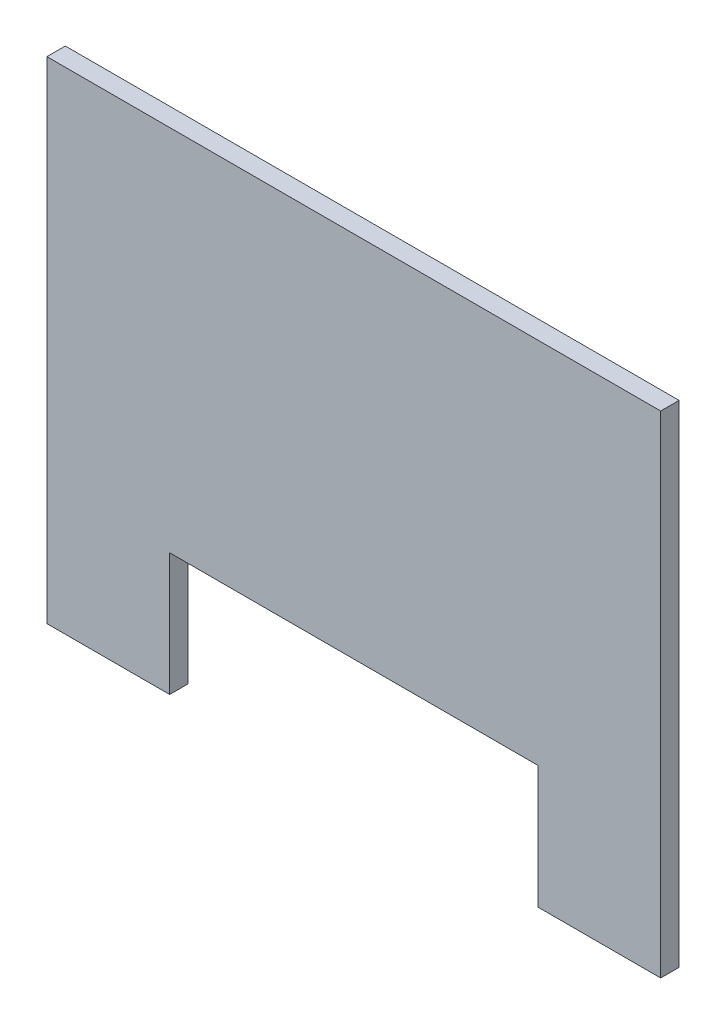
ISO-10303-21;
HEADER;
FILE_DESCRIPTION(('STEP AP214'),'2;1');
FILE_NAME('part.step','',(''),(''),'','','');
FILE_SCHEMA(('AUTOMOTIVE_DESIGN { 1 0 10303 214 1 1 1 1 }'));
ENDSEC;
DATA;
#1=APPLICATION_CONTEXT('core data for automotive mechanical design processes');
#2=APPLICATION_PROTOCOL_DEFINITION('international standard','automotive_design',2000,#1);
#3=PRODUCT_CONTEXT('',#1,'mechanical');
#4=PRODUCT('Part','Part','',(#3));
#5=PRODUCT_RELATED_PRODUCT_CATEGORY('part','',(#4));
#6=PRODUCT_DEFINITION_FORMATION('','',#4);
#7=PRODUCT_DEFINITION_CONTEXT('part definition',#1,'design');
#8=PRODUCT_DEFINITION('design','',#6,#7);
#9=PRODUCT_DEFINITION_SHAPE('','',#8);
#10=(LENGTH_UNIT() NAMED_UNIT(*) SI_UNIT(.MILLI.,.METRE.));
#11=(NAMED_UNIT(*) PLANE_ANGLE_UNIT() SI_UNIT($,.RADIAN.));
#12=(NAMED_UNIT(*) SI_UNIT($,.STERADIAN.) SOLID_ANGLE_UNIT());
#13=UNCERTAINTY_MEASURE_WITH_UNIT(LENGTH_MEASURE(1.E-05),#10,'distance_accuracy_value','');
#14=(GEOMETRIC_REPRESENTATION_CONTEXT(3) GLOBAL_UNCERTAINTY_ASSIGNED_CONTEXT((#13)) GLOBAL_UNIT_ASSIGNED_CONTEXT((#10,
#11,#12)) REPRESENTATION_CONTEXT('',''));
#15=CARTESIAN_POINT('',(0.,0.,0.));
#16=DIRECTION('',(0.,0.,1.));
#17=DIRECTION('',(1.,0.,0.));
#18=AXIS2_PLACEMENT_3D('',#15,#16,#17);
#19=CARTESIAN_POINT('',(-36.6014890834855,-21.0017574692443,3.));
#20=DIRECTION('',(1.,0.,0.));
#21=DIRECTION('',(0.,0.,-1.));
#22=AXIS2_PLACEMENT_3D('',#19,#20,#21);
#23=PLANE('',#22);
#24=DIRECTION('',(0.,-1.,0.));
#25=VECTOR('',#24,1.);
#26=CARTESIAN_POINT('',(-36.6014890834855,-21.0017574692443,0.));
#27=LINE('',#26,#25);
#28=CARTESIAN_POINT('',(-36.6014890834855,18.9279437609842,0.));
#29=VERTEX_POINT('',#28);
#30=CARTESIAN_POINT('',(-36.6014890834855,-61.0720562390158,0.));
#31=VERTEX_POINT('',#30);
#32=EDGE_CURVE('E90',#29,#31,#27,.T.);
#33=ORIENTED_EDGE('',*,*,#32,.T.);
#34=DIRECTION('',(0.,0.,-1.));
#35=VECTOR('',#34,1.);
#36=CARTESIAN_POINT('',(-36.6014890834855,-61.0720562390158,3.));
#37=LINE('',#36,#35);
#38=CARTESIAN_POINT('',(-36.6014890834855,-61.0720562390158,3.));
#39=VERTEX_POINT('',#38);
#40=EDGE_CURVE('E11',#39,#31,#37,.T.);
#41=ORIENTED_EDGE('',*,*,#40,.F.);
#42=DIRECTION('',(0.,-1.,0.));
#43=VECTOR('',#42,1.);
#44=CARTESIAN_POINT('',(-36.6014890834855,18.9279437609842,3.));
#45=LINE('',#44,#43);
#46=CARTESIAN_POINT('',(-36.6014890834855,18.9279437609842,3.));
#47=VERTEX_POINT('',#46);
#48=EDGE_CURVE('E96',#47,#39,#45,.T.);
#49=ORIENTED_EDGE('',*,*,#48,.F.);
#50=DIRECTION('',(0.,0.,-1.));
#51=VECTOR('',#50,1.);
#52=CARTESIAN_POINT('',(-36.6014890834855,18.9279437609842,3.));
#53=LINE('',#52,#51);
#54=EDGE_CURVE('E131',#47,#29,#53,.T.);
#55=ORIENTED_EDGE('',*,*,#54,.T.);
#56=EDGE_LOOP('',(#33,#41,#49,#55));
#57=FACE_BOUND('',#56,.T.);
#58=ADVANCED_FACE('F39',(#57),#23,.F.);
#59=CARTESIAN_POINT('',(-36.6014890834855,-61.0720562390158,3.));
#60=DIRECTION('',(0.,1.,0.));
#61=DIRECTION('',(0.,0.,1.));
#62=AXIS2_PLACEMENT_3D('',#59,#60,#61);
#63=PLANE('',#62);
#64=DIRECTION('',(1.,0.,0.));
#65=VECTOR('',#64,1.);
#66=CARTESIAN_POINT('',(-36.6014890834855,-61.0720562390158,0.));
#67=LINE('',#66,#65);
#68=CARTESIAN_POINT('',(-16.6014890834855,-61.0720562390158,0.));
#69=VERTEX_POINT('',#68);
#70=EDGE_CURVE('E136',#31,#69,#67,.T.);
#71=ORIENTED_EDGE('',*,*,#70,.T.);
#72=DIRECTION('',(0.,0.,-1.));
#73=VECTOR('',#72,1.);
#74=CARTESIAN_POINT('',(-16.6014890834855,-61.0720562390158,3.));
#75=LINE('',#74,#73);
#76=CARTESIAN_POINT('',(-16.6014890834855,-61.0720562390158,3.));
#77=VERTEX_POINT('',#76);
#78=EDGE_CURVE('E47',#77,#69,#75,.T.);
#79=ORIENTED_EDGE('',*,*,#78,.F.);
#80=DIRECTION('',(1.,0.,0.));
#81=VECTOR('',#80,1.);
#82=CARTESIAN_POINT('',(-36.6014890834855,-61.0720562390158,3.));
#83=LINE('',#82,#81);
#84=EDGE_CURVE('E180',#39,#77,#83,.T.);
#85=ORIENTED_EDGE('',*,*,#84,.F.);
#86=ORIENTED_EDGE('',*,*,#40,.T.);
#87=EDGE_LOOP('',(#71,#79,#85,#86));
#88=FACE_BOUND('',#87,.T.);
#89=ADVANCED_FACE('F182',(#88),#63,.F.);
#90=CARTESIAN_POINT('',(-16.6014890834855,-41.0720562390158,3.));
#91=DIRECTION('',(-1.,0.,0.));
#92=DIRECTION('',(0.,-1.,0.));
#93=AXIS2_PLACEMENT_3D('',#90,#91,#92);
#94=PLANE('',#93);
#95=DIRECTION('',(0.,1.,0.));
#96=VECTOR('',#95,1.);
#97=CARTESIAN_POINT('',(-16.6014890834855,-41.0720562390158,0.));
#98=LINE('',#97,#96);
#99=CARTESIAN_POINT('',(-16.6014890834855,-41.0720562390158,0.));
#100=VERTEX_POINT('',#99);
#101=EDGE_CURVE('E138',#69,#100,#98,.T.);
#102=ORIENTED_EDGE('',*,*,#101,.T.);
#103=DIRECTION('',(0.,0.,-1.));
#104=VECTOR('',#103,1.);
#105=CARTESIAN_POINT('',(-16.6014890834855,-41.0720562390158,3.));
#106=LINE('',#105,#104);
#107=CARTESIAN_POINT('',(-16.6014890834855,-41.0720562390158,3.));
#108=VERTEX_POINT('',#107);
#109=EDGE_CURVE('E155',#108,#100,#106,.T.);
#110=ORIENTED_EDGE('',*,*,#109,.F.);
#111=DIRECTION('',(0.,1.,0.));
#112=VECTOR('',#111,1.);
#113=CARTESIAN_POINT('',(-16.6014890834855,-41.0720562390158,3.));
#114=LINE('',#113,#112);
#115=EDGE_CURVE('E164',#77,#108,#114,.T.);
#116=ORIENTED_EDGE('',*,*,#115,.F.);
#117=ORIENTED_EDGE('',*,*,#78,.T.);
#118=EDGE_LOOP('',(#102,#110,#116,#117));
#119=FACE_BOUND('',#118,.T.);
#120=ADVANCED_FACE('F162',(#119),#94,.F.);
#121=CARTESIAN_POINT('',(-16.6014890834855,-41.0720562390158,3.));
#122=DIRECTION('',(0.,1.,0.));
#123=DIRECTION('',(-1.,0.,0.));
#124=AXIS2_PLACEMENT_3D('',#121,#122,#123);
#125=PLANE('',#124);
#126=DIRECTION('',(1.,0.,0.));
#127=VECTOR('',#126,1.);
#128=CARTESIAN_POINT('',(-16.6014890834855,-41.0720562390158,0.));
#129=LINE('',#128,#127);
#130=CARTESIAN_POINT('',(43.3985109165145,-41.0720562390158,0.));
#131=VERTEX_POINT('',#130);
#132=EDGE_CURVE('E140',#100,#131,#129,.T.);
#133=ORIENTED_EDGE('',*,*,#132,.T.);
#134=DIRECTION('',(0.,0.,-1.));
#135=VECTOR('',#134,1.);
#136=CARTESIAN_POINT('',(43.3985109165145,-41.0720562390158,3.));
#137=LINE('',#136,#135);
#138=CARTESIAN_POINT('',(43.3985109165145,-41.0720562390158,3.));
#139=VERTEX_POINT('',#138);
#140=EDGE_CURVE('E152',#139,#131,#137,.T.);
#141=ORIENTED_EDGE('',*,*,#140,.F.);
#142=DIRECTION('',(1.,0.,0.));
#143=VECTOR('',#142,1.);
#144=CARTESIAN_POINT('',(-16.6014890834855,-41.0720562390158,3.));
#145=LINE('',#144,#143);
#146=EDGE_CURVE('E176',#108,#139,#145,.T.);
#147=ORIENTED_EDGE('',*,*,#146,.F.);
#148=ORIENTED_EDGE('',*,*,#109,.T.);
#149=EDGE_LOOP('',(#133,#141,#147,#148));
#150=FACE_BOUND('',#149,.T.);
#151=ADVANCED_FACE('F172',(#150),#125,.F.);
#152=CARTESIAN_POINT('',(43.3985109165145,-41.0720562390158,3.));
#153=DIRECTION('',(1.,0.,0.));
#154=DIRECTION('',(0.,0.,-1.));
#155=AXIS2_PLACEMENT_3D('',#152,#153,#154);
#156=PLANE('',#155);
#157=DIRECTION('',(0.,-1.,0.));
#158=VECTOR('',#157,1.);
#159=CARTESIAN_POINT('',(43.3985109165145,-41.0720562390158,0.));
#160=LINE('',#159,#158);
#161=CARTESIAN_POINT('',(43.3985109165145,-61.0720562390158,0.));
#162=VERTEX_POINT('',#161);
#163=EDGE_CURVE('E142',#131,#162,#160,.T.);
#164=ORIENTED_EDGE('',*,*,#163,.T.);
#165=DIRECTION('',(0.,0.,-1.));
#166=VECTOR('',#165,1.);
#167=CARTESIAN_POINT('',(43.3985109165145,-61.0720562390158,3.));
#168=LINE('',#167,#166);
#169=CARTESIAN_POINT('',(43.3985109165145,-61.0720562390158,3.));
#170=VERTEX_POINT('',#169);
#171=EDGE_CURVE('E126',#170,#162,#168,.T.);
#172=ORIENTED_EDGE('',*,*,#171,.F.);
#173=DIRECTION('',(0.,-1.,0.));
#174=VECTOR('',#173,1.);
#175=CARTESIAN_POINT('',(43.3985109165145,-41.0720562390158,3.));
#176=LINE('',#175,#174);
#177=EDGE_CURVE('E116',#139,#170,#176,.T.);
#178=ORIENTED_EDGE('',*,*,#177,.F.);
#179=ORIENTED_EDGE('',*,*,#140,.T.);
#180=EDGE_LOOP('',(#164,#172,#178,#179));
#181=FACE_BOUND('',#180,.T.);
#182=ADVANCED_FACE('F175',(#181),#156,.F.);
#183=CARTESIAN_POINT('',(63.3985109165145,-61.0720562390158,3.));
#184=DIRECTION('',(0.,1.,0.));
#185=DIRECTION('',(0.,0.,1.));
#186=AXIS2_PLACEMENT_3D('',#183,#184,#185);
#187=PLANE('',#186);
#188=DIRECTION('',(1.,0.,0.));
#189=VECTOR('',#188,1.);
#190=CARTESIAN_POINT('',(63.3985109165145,-61.0720562390158,0.));
#191=LINE('',#190,#189);
#192=CARTESIAN_POINT('',(63.3985109165145,-61.0720562390158,0.));
#193=VERTEX_POINT('',#192);
#194=EDGE_CURVE('E125',#162,#193,#191,.T.);
#195=ORIENTED_EDGE('',*,*,#194,.T.);
#196=DIRECTION('',(0.,0.,-1.));
#197=VECTOR('',#196,1.);
#198=CARTESIAN_POINT('',(63.3985109165145,-61.0720562390158,3.));
#199=LINE('',#198,#197);
#200=CARTESIAN_POINT('',(63.3985109165145,-61.0720562390158,3.));
#201=VERTEX_POINT('',#200);
#202=EDGE_CURVE('E122',#201,#193,#199,.T.);
#203=ORIENTED_EDGE('',*,*,#202,.F.);
#204=DIRECTION('',(1.,0.,0.));
#205=VECTOR('',#204,1.);
#206=CARTESIAN_POINT('',(63.3985109165145,-61.0720562390158,3.));
#207=LINE('',#206,#205);
#208=EDGE_CURVE('E110',#170,#201,#207,.T.);
#209=ORIENTED_EDGE('',*,*,#208,.F.);
#210=ORIENTED_EDGE('',*,*,#171,.T.);
#211=EDGE_LOOP('',(#195,#203,#209,#210));
#212=FACE_BOUND('',#211,.T.);
#213=ADVANCED_FACE('F123',(#212),#187,.F.);
#214=CARTESIAN_POINT('',(63.3985109165145,18.9279437609842,3.));
#215=DIRECTION('',(-1.,0.,0.));
#216=DIRECTION('',(0.,-1.,0.));
#217=AXIS2_PLACEMENT_3D('',#214,#215,#216);
#218=PLANE('',#217);
#219=DIRECTION('',(0.,1.,0.));
#220=VECTOR('',#219,1.);
#221=CARTESIAN_POINT('',(63.3985109165145,18.9279437609842,0.));
#222=LINE('',#221,#220);
#223=CARTESIAN_POINT('',(63.3985109165145,18.9279437609842,0.));
#224=VERTEX_POINT('',#223);
#225=EDGE_CURVE('E83',#193,#224,#222,.T.);
#226=ORIENTED_EDGE('',*,*,#225,.T.);
#227=DIRECTION('',(0.,0.,-1.));
#228=VECTOR('',#227,1.);
#229=CARTESIAN_POINT('',(63.3985109165145,18.9279437609842,3.));
#230=LINE('',#229,#228);
#231=CARTESIAN_POINT('',(63.3985109165145,18.9279437609842,3.));
#232=VERTEX_POINT('',#231);
#233=EDGE_CURVE('E127',#232,#224,#230,.T.);
#234=ORIENTED_EDGE('',*,*,#233,.F.);
#235=DIRECTION('',(0.,1.,0.));
#236=VECTOR('',#235,1.);
#237=CARTESIAN_POINT('',(63.3985109165145,-26.414762741652,3.));
#238=LINE('',#237,#236);
#239=EDGE_CURVE('E114',#201,#232,#238,.T.);
#240=ORIENTED_EDGE('',*,*,#239,.F.);
#241=ORIENTED_EDGE('',*,*,#202,.T.);
#242=EDGE_LOOP('',(#226,#234,#240,#241));
#243=FACE_BOUND('',#242,.T.);
#244=ADVANCED_FACE('F129',(#243),#218,.F.);
#245=CARTESIAN_POINT('',(-36.6014890834855,18.9279437609842,3.));
#246=DIRECTION('',(0.,-1.,0.));
#247=DIRECTION('',(1.,0.,0.));
#248=AXIS2_PLACEMENT_3D('',#245,#246,#247);
#249=PLANE('',#248);
#250=DIRECTION('',(-1.,0.,0.));
#251=VECTOR('',#250,1.);
#252=CARTESIAN_POINT('',(-36.6014890834855,18.9279437609842,0.));
#253=LINE('',#252,#251);
#254=EDGE_CURVE('E146',#224,#29,#253,.T.);
#255=ORIENTED_EDGE('',*,*,#254,.T.);
#256=ORIENTED_EDGE('',*,*,#54,.F.);
#257=DIRECTION('',(-1.,0.,0.));
#258=VECTOR('',#257,1.);
#259=CARTESIAN_POINT('',(-36.6014890834855,18.9279437609842,3.));
#260=LINE('',#259,#258);
#261=EDGE_CURVE('E55',#232,#47,#260,.T.);
#262=ORIENTED_EDGE('',*,*,#261,.F.);
#263=ORIENTED_EDGE('',*,*,#233,.T.);
#264=EDGE_LOOP('',(#255,#256,#262,#263));
#265=FACE_BOUND('',#264,.T.);
#266=ADVANCED_FACE('F185',(#265),#249,.F.);
#267=CARTESIAN_POINT('',(0.,0.,3.));
#268=DIRECTION('',(0.,0.,1.));
#269=DIRECTION('',(1.,0.,0.));
#270=AXIS2_PLACEMENT_3D('',#267,#268,#269);
#271=PLANE('',#270);
#272=ORIENTED_EDGE('',*,*,#48,.T.);
#273=ORIENTED_EDGE('',*,*,#84,.T.);
#274=ORIENTED_EDGE('',*,*,#115,.T.);
#275=ORIENTED_EDGE('',*,*,#146,.T.);
#276=ORIENTED_EDGE('',*,*,#177,.T.);
#277=ORIENTED_EDGE('',*,*,#208,.T.);
#278=ORIENTED_EDGE('',*,*,#239,.T.);
#279=ORIENTED_EDGE('',*,*,#261,.T.);
#280=EDGE_LOOP('',(#272,#273,#274,#275,#276,#277,#278,#279));
#281=FACE_BOUND('',#280,.T.);
#282=ADVANCED_FACE('F112',(#281),#271,.T.);
#283=CARTESIAN_POINT('',(0.,0.,0.));
#284=DIRECTION('',(0.,0.,1.));
#285=DIRECTION('',(1.,0.,0.));
#286=AXIS2_PLACEMENT_3D('',#283,#284,#285);
#287=PLANE('',#286);
#288=ORIENTED_EDGE('',*,*,#32,.F.);
#289=ORIENTED_EDGE('',*,*,#254,.F.);
#290=ORIENTED_EDGE('',*,*,#225,.F.);
#291=ORIENTED_EDGE('',*,*,#194,.F.);
#292=ORIENTED_EDGE('',*,*,#163,.F.);
#293=ORIENTED_EDGE('',*,*,#132,.F.);
#294=ORIENTED_EDGE('',*,*,#101,.F.);
#295=ORIENTED_EDGE('',*,*,#70,.F.);
#296=EDGE_LOOP('',(#288,#289,#290,#291,#292,#293,#294,#295));
#297=FACE_BOUND('',#296,.T.);
#298=ADVANCED_FACE('F168',(#297),#287,.F.);
#299=CLOSED_SHELL('',(#58,#89,#120,#151,#182,#213,#244,#266,#282,#298));
#300=MANIFOLD_SOLID_BREP('B2',#299);
#301=ADVANCED_BREP_SHAPE_REPRESENTATION('',(#18,#300),#14);
#302=SHAPE_DEFINITION_REPRESENTATION(#9,#301);
ENDSEC;
END-ISO-10303-21;
